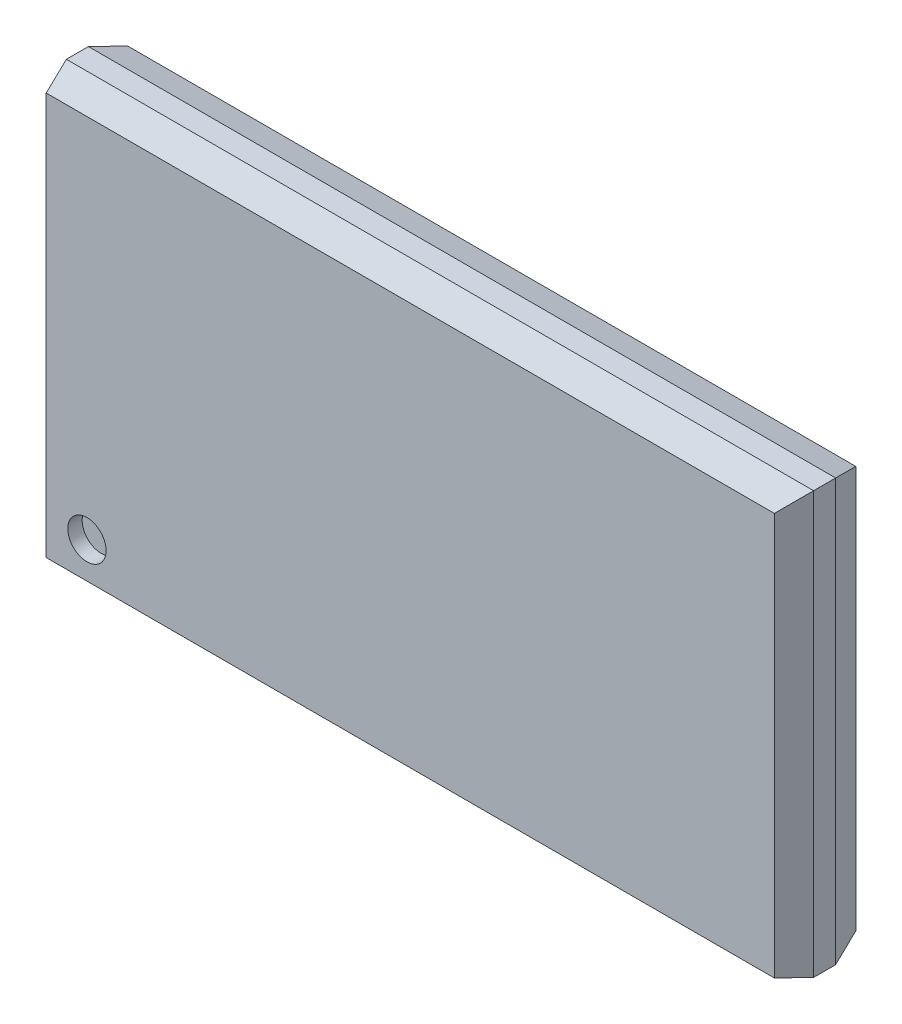
ISO-10303-21;
HEADER;
FILE_DESCRIPTION(('STEP AP214'),'2;1');
FILE_NAME('part.step','',(''),(''),'','','');
FILE_SCHEMA(('AUTOMOTIVE_DESIGN { 1 0 10303 214 1 1 1 1 }'));
ENDSEC;
DATA;
#1=APPLICATION_CONTEXT('core data for automotive mechanical design processes');
#2=APPLICATION_PROTOCOL_DEFINITION('international standard','automotive_design',2000,#1);
#3=PRODUCT_CONTEXT('',#1,'mechanical');
#4=PRODUCT('Part','Part','',(#3));
#5=PRODUCT_RELATED_PRODUCT_CATEGORY('part','',(#4));
#6=PRODUCT_DEFINITION_FORMATION('','',#4);
#7=PRODUCT_DEFINITION_CONTEXT('part definition',#1,'design');
#8=PRODUCT_DEFINITION('design','',#6,#7);
#9=PRODUCT_DEFINITION_SHAPE('','',#8);
#10=(LENGTH_UNIT() NAMED_UNIT(*) SI_UNIT(.MILLI.,.METRE.));
#11=(NAMED_UNIT(*) PLANE_ANGLE_UNIT() SI_UNIT($,.RADIAN.));
#12=(NAMED_UNIT(*) SI_UNIT($,.STERADIAN.) SOLID_ANGLE_UNIT());
#13=UNCERTAINTY_MEASURE_WITH_UNIT(LENGTH_MEASURE(1.E-05),#10,'distance_accuracy_value','');
#14=(GEOMETRIC_REPRESENTATION_CONTEXT(3) GLOBAL_UNCERTAINTY_ASSIGNED_CONTEXT((#13)) GLOBAL_UNIT_ASSIGNED_CONTEXT((#10,
#11,#12)) REPRESENTATION_CONTEXT('',''));
#15=CARTESIAN_POINT('',(0.,0.,0.));
#16=DIRECTION('',(0.,0.,1.));
#17=DIRECTION('',(1.,0.,0.));
#18=AXIS2_PLACEMENT_3D('',#15,#16,#17);
#19=CARTESIAN_POINT('',(-3.375,-1.725,0.85));
#20=DIRECTION('',(0.,0.,1.));
#21=DIRECTION('',(1.,0.,0.));
#22=AXIS2_PLACEMENT_3D('',#19,#20,#21);
#23=PLANE('',#22);
#24=CARTESIAN_POINT('',(-3.375,-1.725,0.85));
#25=DIRECTION('',(0.,0.,-1.));
#26=DIRECTION('',(-1.,0.,0.));
#27=AXIS2_PLACEMENT_3D('',#24,#25,#26);
#28=CIRCLE('',#27,0.2);
#29=CARTESIAN_POINT('',(-3.575,-1.725,0.85));
#30=VERTEX_POINT('',#29);
#31=EDGE_CURVE('E19',#30,#30,#28,.F.);
#32=ORIENTED_EDGE('',*,*,#31,.T.);
#33=EDGE_LOOP('',(#32));
#34=FACE_BOUND('',#33,.T.);
#35=ADVANCED_FACE('F16',(#34),#23,.T.);
#36=CARTESIAN_POINT('',(-3.375,-1.725,1.85));
#37=DIRECTION('',(0.,0.,-1.));
#38=DIRECTION('',(-1.,0.,0.));
#39=AXIS2_PLACEMENT_3D('',#36,#37,#38);
#40=CYLINDRICAL_SURFACE('',#39,0.2);
#41=ORIENTED_EDGE('',*,*,#31,.F.);
#42=EDGE_LOOP('',(#41));
#43=FACE_BOUND('',#42,.T.);
#44=CARTESIAN_POINT('',(-3.375,-1.725,1.));
#45=DIRECTION('',(0.,0.,-1.));
#46=DIRECTION('',(-1.,0.,0.));
#47=AXIS2_PLACEMENT_3D('',#44,#45,#46);
#48=CIRCLE('',#47,0.2);
#49=CARTESIAN_POINT('',(-3.575,-1.725,1.));
#50=VERTEX_POINT('',#49);
#51=EDGE_CURVE('E100',#50,#50,#48,.T.);
#52=ORIENTED_EDGE('',*,*,#51,.F.);
#53=EDGE_LOOP('',(#52));
#54=FACE_BOUND('',#53,.T.);
#55=ADVANCED_FACE('F115',(#43,#54),#40,.F.);
#56=CARTESIAN_POINT('',(0.,0.,1.));
#57=DIRECTION('',(0.,0.,1.));
#58=DIRECTION('',(1.,0.,0.));
#59=AXIS2_PLACEMENT_3D('',#56,#57,#58);
#60=PLANE('',#59);
#61=ORIENTED_EDGE('',*,*,#51,.T.);
#62=EDGE_LOOP('',(#61));
#63=FACE_BOUND('',#62,.T.);
#64=DIRECTION('',(0.,1.,0.));
#65=VECTOR('',#64,1.);
#66=CARTESIAN_POINT('',(-3.8,0.,1.));
#67=LINE('',#66,#65);
#68=CARTESIAN_POINT('',(-3.8,-2.1,1.));
#69=VERTEX_POINT('',#68);
#70=CARTESIAN_POINT('',(-3.8,2.1,1.));
#71=VERTEX_POINT('',#70);
#72=EDGE_CURVE('E96',#69,#71,#67,.T.);
#73=ORIENTED_EDGE('',*,*,#72,.F.);
#74=DIRECTION('',(1.,0.,0.));
#75=VECTOR('',#74,1.);
#76=CARTESIAN_POINT('',(0.,-2.1,1.));
#77=LINE('',#76,#75);
#78=CARTESIAN_POINT('',(3.8,-2.1,1.));
#79=VERTEX_POINT('',#78);
#80=EDGE_CURVE('E91',#79,#69,#77,.F.);
#81=ORIENTED_EDGE('',*,*,#80,.F.);
#82=DIRECTION('',(0.,1.,0.));
#83=VECTOR('',#82,1.);
#84=CARTESIAN_POINT('',(3.8,0.,1.));
#85=LINE('',#84,#83);
#86=CARTESIAN_POINT('',(3.8,2.1,1.));
#87=VERTEX_POINT('',#86);
#88=EDGE_CURVE('E82',#79,#87,#85,.T.);
#89=ORIENTED_EDGE('',*,*,#88,.T.);
#90=DIRECTION('',(1.,0.,0.));
#91=VECTOR('',#90,1.);
#92=CARTESIAN_POINT('',(0.,2.1,1.));
#93=LINE('',#92,#91);
#94=EDGE_CURVE('E77',#87,#71,#93,.F.);
#95=ORIENTED_EDGE('',*,*,#94,.T.);
#96=EDGE_LOOP('',(#73,#81,#89,#95));
#97=FACE_BOUND('',#96,.T.);
#98=ADVANCED_FACE('F94',(#63,#97),#60,.T.);
#99=CARTESIAN_POINT('',(0.,-2.1,1.));
#100=DIRECTION('',(0.,-0.951708617760551,0.307002779922758));
#101=DIRECTION('',(0.,-0.307002779922758,-0.951708617760551));
#102=AXIS2_PLACEMENT_3D('',#99,#100,#101);
#103=PLANE('',#102);
#104=DIRECTION('',(0.293483635441874,0.293483635441875,0.909799269869811));
#105=VECTOR('',#104,1.);
#106=CARTESIAN_POINT('',(-3.9,-2.2,0.69));
#107=LINE('',#106,#105);
#108=CARTESIAN_POINT('',(-3.9,-2.2,0.69));
#109=VERTEX_POINT('',#108);
#110=EDGE_CURVE('E337',#109,#69,#107,.T.);
#111=ORIENTED_EDGE('',*,*,#110,.F.);
#112=DIRECTION('',(-1.,0.,0.));
#113=VECTOR('',#112,1.);
#114=CARTESIAN_POINT('',(0.,-2.2,0.69));
#115=LINE('',#114,#113);
#116=CARTESIAN_POINT('',(3.9,-2.2,0.69));
#117=VERTEX_POINT('',#116);
#118=EDGE_CURVE('E103',#109,#117,#115,.F.);
#119=ORIENTED_EDGE('',*,*,#118,.T.);
#120=DIRECTION('',(-0.293483635441874,0.293483635441875,0.909799269869811));
#121=VECTOR('',#120,1.);
#122=CARTESIAN_POINT('',(3.9,-2.2,0.69));
#123=LINE('',#122,#121);
#124=EDGE_CURVE('E87',#117,#79,#123,.T.);
#125=ORIENTED_EDGE('',*,*,#124,.T.);
#126=ORIENTED_EDGE('',*,*,#80,.T.);
#127=EDGE_LOOP('',(#111,#119,#125,#126));
#128=FACE_BOUND('',#127,.T.);
#129=ADVANCED_FACE('F102',(#128),#103,.T.);
#130=CARTESIAN_POINT('',(3.9,0.,0.69));
#131=DIRECTION('',(-0.951708617760551,0.,-0.307002779922758));
#132=DIRECTION('',(-0.307002779922758,0.,0.951708617760551));
#133=AXIS2_PLACEMENT_3D('',#130,#131,#132);
#134=PLANE('',#133);
#135=DIRECTION('',(0.,1.,0.));
#136=VECTOR('',#135,1.);
#137=CARTESIAN_POINT('',(3.9,0.,0.69));
#138=LINE('',#137,#136);
#139=CARTESIAN_POINT('',(3.9,2.2,0.69));
#140=VERTEX_POINT('',#139);
#141=EDGE_CURVE('E331',#140,#117,#138,.F.);
#142=ORIENTED_EDGE('',*,*,#141,.F.);
#143=DIRECTION('',(-0.293483635441874,-0.293483635441874,0.909799269869812));
#144=VECTOR('',#143,1.);
#145=CARTESIAN_POINT('',(3.9,2.2,0.69));
#146=LINE('',#145,#144);
#147=EDGE_CURVE('E89',#140,#87,#146,.T.);
#148=ORIENTED_EDGE('',*,*,#147,.T.);
#149=ORIENTED_EDGE('',*,*,#88,.F.);
#150=ORIENTED_EDGE('',*,*,#124,.F.);
#151=EDGE_LOOP('',(#142,#148,#149,#150));
#152=FACE_BOUND('',#151,.T.);
#153=ADVANCED_FACE('F85',(#152),#134,.F.);
#154=CARTESIAN_POINT('',(0.,2.2,0.69));
#155=DIRECTION('',(0.,-0.951708617760551,-0.307002779922758));
#156=DIRECTION('',(0.,0.307002779922758,-0.951708617760551));
#157=AXIS2_PLACEMENT_3D('',#154,#155,#156);
#158=PLANE('',#157);
#159=DIRECTION('',(-1.,0.,0.));
#160=VECTOR('',#159,1.);
#161=CARTESIAN_POINT('',(0.,2.2,0.69));
#162=LINE('',#161,#160);
#163=CARTESIAN_POINT('',(-3.9,2.2,0.69));
#164=VERTEX_POINT('',#163);
#165=EDGE_CURVE('E305',#164,#140,#162,.F.);
#166=ORIENTED_EDGE('',*,*,#165,.F.);
#167=DIRECTION('',(-0.293483635441874,0.293483635441875,-0.909799269869811));
#168=VECTOR('',#167,1.);
#169=CARTESIAN_POINT('',(-3.8,2.1,1.));
#170=LINE('',#169,#168);
#171=EDGE_CURVE('E307',#71,#164,#170,.T.);
#172=ORIENTED_EDGE('',*,*,#171,.F.);
#173=ORIENTED_EDGE('',*,*,#94,.F.);
#174=ORIENTED_EDGE('',*,*,#147,.F.);
#175=EDGE_LOOP('',(#166,#172,#173,#174));
#176=FACE_BOUND('',#175,.T.);
#177=ADVANCED_FACE('F166',(#176),#158,.F.);
#178=CARTESIAN_POINT('',(-3.8,0.,1.));
#179=DIRECTION('',(-0.951708617760551,0.,0.307002779922758));
#180=DIRECTION('',(0.307002779922758,0.,0.951708617760551));
#181=AXIS2_PLACEMENT_3D('',#178,#179,#180);
#182=PLANE('',#181);
#183=ORIENTED_EDGE('',*,*,#110,.T.);
#184=ORIENTED_EDGE('',*,*,#72,.T.);
#185=ORIENTED_EDGE('',*,*,#171,.T.);
#186=DIRECTION('',(0.,1.,0.));
#187=VECTOR('',#186,1.);
#188=CARTESIAN_POINT('',(-3.9,0.,0.69));
#189=LINE('',#188,#187);
#190=EDGE_CURVE('E309',#164,#109,#189,.F.);
#191=ORIENTED_EDGE('',*,*,#190,.T.);
#192=EDGE_LOOP('',(#183,#184,#185,#191));
#193=FACE_BOUND('',#192,.T.);
#194=ADVANCED_FACE('F162',(#193),#182,.T.);
#195=CARTESIAN_POINT('',(0.,-2.2,1.));
#196=DIRECTION('',(0.,1.,0.));
#197=DIRECTION('',(-1.,0.,0.));
#198=AXIS2_PLACEMENT_3D('',#195,#196,#197);
#199=PLANE('',#198);
#200=DIRECTION('',(1.,0.,0.));
#201=VECTOR('',#200,1.);
#202=CARTESIAN_POINT('',(0.,-2.2,0.46));
#203=LINE('',#202,#201);
#204=CARTESIAN_POINT('',(-3.9,-2.2,0.46));
#205=VERTEX_POINT('',#204);
#206=CARTESIAN_POINT('',(3.9,-2.2,0.46));
#207=VERTEX_POINT('',#206);
#208=EDGE_CURVE('E318',#205,#207,#203,.T.);
#209=ORIENTED_EDGE('',*,*,#208,.T.);
#210=DIRECTION('',(0.,0.,-1.));
#211=VECTOR('',#210,1.);
#212=CARTESIAN_POINT('',(3.9,-2.2,1.));
#213=LINE('',#212,#211);
#214=EDGE_CURVE('E333',#117,#207,#213,.T.);
#215=ORIENTED_EDGE('',*,*,#214,.F.);
#216=ORIENTED_EDGE('',*,*,#118,.F.);
#217=DIRECTION('',(0.,0.,-1.));
#218=VECTOR('',#217,1.);
#219=CARTESIAN_POINT('',(-3.9,-2.2,1.));
#220=LINE('',#219,#218);
#221=EDGE_CURVE('E319',#109,#205,#220,.T.);
#222=ORIENTED_EDGE('',*,*,#221,.T.);
#223=EDGE_LOOP('',(#209,#215,#216,#222));
#224=FACE_BOUND('',#223,.T.);
#225=ADVANCED_FACE('F158',(#224),#199,.F.);
#226=CARTESIAN_POINT('',(3.9,0.,1.));
#227=DIRECTION('',(1.,0.,0.));
#228=DIRECTION('',(0.,0.,-1.));
#229=AXIS2_PLACEMENT_3D('',#226,#227,#228);
#230=PLANE('',#229);
#231=DIRECTION('',(0.,0.,1.));
#232=VECTOR('',#231,1.);
#233=CARTESIAN_POINT('',(3.9,2.2,1.));
#234=LINE('',#233,#232);
#235=CARTESIAN_POINT('',(3.9,2.2,0.46));
#236=VERTEX_POINT('',#235);
#237=EDGE_CURVE('E310',#140,#236,#234,.F.);
#238=ORIENTED_EDGE('',*,*,#237,.F.);
#239=ORIENTED_EDGE('',*,*,#141,.T.);
#240=ORIENTED_EDGE('',*,*,#214,.T.);
#241=DIRECTION('',(0.,1.,0.));
#242=VECTOR('',#241,1.);
#243=CARTESIAN_POINT('',(3.9,0.,0.46));
#244=LINE('',#243,#242);
#245=EDGE_CURVE('E358',#236,#207,#244,.F.);
#246=ORIENTED_EDGE('',*,*,#245,.F.);
#247=EDGE_LOOP('',(#238,#239,#240,#246));
#248=FACE_BOUND('',#247,.T.);
#249=ADVANCED_FACE('F154',(#248),#230,.T.);
#250=CARTESIAN_POINT('',(0.,2.2,1.));
#251=DIRECTION('',(0.,1.,0.));
#252=DIRECTION('',(-1.,0.,0.));
#253=AXIS2_PLACEMENT_3D('',#250,#251,#252);
#254=PLANE('',#253);
#255=DIRECTION('',(0.,0.,-1.));
#256=VECTOR('',#255,1.);
#257=CARTESIAN_POINT('',(-3.9,2.2,1.));
#258=LINE('',#257,#256);
#259=CARTESIAN_POINT('',(-3.9,2.2,0.46));
#260=VERTEX_POINT('',#259);
#261=EDGE_CURVE('E313',#260,#164,#258,.F.);
#262=ORIENTED_EDGE('',*,*,#261,.T.);
#263=ORIENTED_EDGE('',*,*,#165,.T.);
#264=ORIENTED_EDGE('',*,*,#237,.T.);
#265=DIRECTION('',(1.,0.,0.));
#266=VECTOR('',#265,1.);
#267=CARTESIAN_POINT('',(0.,2.2,0.46));
#268=LINE('',#267,#266);
#269=EDGE_CURVE('E315',#260,#236,#268,.T.);
#270=ORIENTED_EDGE('',*,*,#269,.F.);
#271=EDGE_LOOP('',(#262,#263,#264,#270));
#272=FACE_BOUND('',#271,.T.);
#273=ADVANCED_FACE('F150',(#272),#254,.T.);
#274=CARTESIAN_POINT('',(-3.9,0.,1.));
#275=DIRECTION('',(1.,0.,0.));
#276=DIRECTION('',(0.,0.,-1.));
#277=AXIS2_PLACEMENT_3D('',#274,#275,#276);
#278=PLANE('',#277);
#279=DIRECTION('',(0.,1.,0.));
#280=VECTOR('',#279,1.);
#281=CARTESIAN_POINT('',(-3.9,0.,0.46));
#282=LINE('',#281,#280);
#283=EDGE_CURVE('E340',#260,#205,#282,.F.);
#284=ORIENTED_EDGE('',*,*,#283,.T.);
#285=ORIENTED_EDGE('',*,*,#221,.F.);
#286=ORIENTED_EDGE('',*,*,#190,.F.);
#287=ORIENTED_EDGE('',*,*,#261,.F.);
#288=EDGE_LOOP('',(#284,#285,#286,#287));
#289=FACE_BOUND('',#288,.T.);
#290=ADVANCED_FACE('F146',(#289),#278,.F.);
#291=CARTESIAN_POINT('',(0.,-2.2,0.46));
#292=DIRECTION('',(0.,0.951708617760551,0.307002779922758));
#293=DIRECTION('',(0.,-0.307002779922758,0.951708617760551));
#294=AXIS2_PLACEMENT_3D('',#291,#292,#293);
#295=PLANE('',#294);
#296=ORIENTED_EDGE('',*,*,#208,.F.);
#297=DIRECTION('',(0.293483635441874,0.293483635441875,-0.909799269869811));
#298=VECTOR('',#297,1.);
#299=CARTESIAN_POINT('',(-3.9,-2.2,0.46));
#300=LINE('',#299,#298);
#301=CARTESIAN_POINT('',(-3.8,-2.1,0.15));
#302=VERTEX_POINT('',#301);
#303=EDGE_CURVE('E345',#205,#302,#300,.T.);
#304=ORIENTED_EDGE('',*,*,#303,.T.);
#305=DIRECTION('',(1.,0.,0.));
#306=VECTOR('',#305,1.);
#307=CARTESIAN_POINT('',(0.,-2.1,0.15));
#308=LINE('',#307,#306);
#309=CARTESIAN_POINT('',(3.8,-2.1,0.15));
#310=VERTEX_POINT('',#309);
#311=EDGE_CURVE('E347',#302,#310,#308,.T.);
#312=ORIENTED_EDGE('',*,*,#311,.T.);
#313=DIRECTION('',(-0.293483635441874,0.293483635441875,-0.909799269869811));
#314=VECTOR('',#313,1.);
#315=CARTESIAN_POINT('',(3.9,-2.2,0.46));
#316=LINE('',#315,#314);
#317=EDGE_CURVE('E322',#207,#310,#316,.T.);
#318=ORIENTED_EDGE('',*,*,#317,.F.);
#319=EDGE_LOOP('',(#296,#304,#312,#318));
#320=FACE_BOUND('',#319,.T.);
#321=ADVANCED_FACE('F142',(#320),#295,.F.);
#322=CARTESIAN_POINT('',(3.8,0.,0.15));
#323=DIRECTION('',(0.951708617760551,0.,-0.307002779922758));
#324=DIRECTION('',(-0.307002779922758,0.,-0.951708617760551));
#325=AXIS2_PLACEMENT_3D('',#322,#323,#324);
#326=PLANE('',#325);
#327=DIRECTION('',(-0.293483635441874,-0.293483635441874,-0.909799269869812));
#328=VECTOR('',#327,1.);
#329=CARTESIAN_POINT('',(3.9,2.2,0.46));
#330=LINE('',#329,#328);
#331=CARTESIAN_POINT('',(3.8,2.1,0.15));
#332=VERTEX_POINT('',#331);
#333=EDGE_CURVE('E355',#236,#332,#330,.T.);
#334=ORIENTED_EDGE('',*,*,#333,.F.);
#335=ORIENTED_EDGE('',*,*,#245,.T.);
#336=ORIENTED_EDGE('',*,*,#317,.T.);
#337=DIRECTION('',(0.,1.,0.));
#338=VECTOR('',#337,1.);
#339=CARTESIAN_POINT('',(3.8,0.,0.15));
#340=LINE('',#339,#338);
#341=EDGE_CURVE('E349',#310,#332,#340,.T.);
#342=ORIENTED_EDGE('',*,*,#341,.T.);
#343=EDGE_LOOP('',(#334,#335,#336,#342));
#344=FACE_BOUND('',#343,.T.);
#345=ADVANCED_FACE('F138',(#344),#326,.T.);
#346=CARTESIAN_POINT('',(0.,2.1,0.15));
#347=DIRECTION('',(0.,0.951708617760551,-0.307002779922758));
#348=DIRECTION('',(0.,0.307002779922758,0.951708617760551));
#349=AXIS2_PLACEMENT_3D('',#346,#347,#348);
#350=PLANE('',#349);
#351=ORIENTED_EDGE('',*,*,#333,.T.);
#352=DIRECTION('',(1.,0.,0.));
#353=VECTOR('',#352,1.);
#354=CARTESIAN_POINT('',(0.,2.1,0.15));
#355=LINE('',#354,#353);
#356=CARTESIAN_POINT('',(-3.8,2.1,0.15));
#357=VERTEX_POINT('',#356);
#358=EDGE_CURVE('E25',#332,#357,#355,.F.);
#359=ORIENTED_EDGE('',*,*,#358,.T.);
#360=DIRECTION('',(-0.293483635441874,0.293483635441875,0.909799269869811));
#361=VECTOR('',#360,1.);
#362=CARTESIAN_POINT('',(-3.8,2.1,0.15));
#363=LINE('',#362,#361);
#364=EDGE_CURVE('E33',#357,#260,#363,.T.);
#365=ORIENTED_EDGE('',*,*,#364,.T.);
#366=ORIENTED_EDGE('',*,*,#269,.T.);
#367=EDGE_LOOP('',(#351,#359,#365,#366));
#368=FACE_BOUND('',#367,.T.);
#369=ADVANCED_FACE('F132',(#368),#350,.T.);
#370=CARTESIAN_POINT('',(-3.9,0.,0.46));
#371=DIRECTION('',(0.951708617760551,0.,0.307002779922758));
#372=DIRECTION('',(0.307002779922758,0.,-0.951708617760551));
#373=AXIS2_PLACEMENT_3D('',#370,#371,#372);
#374=PLANE('',#373);
#375=ORIENTED_EDGE('',*,*,#283,.F.);
#376=ORIENTED_EDGE('',*,*,#364,.F.);
#377=DIRECTION('',(0.,1.,0.));
#378=VECTOR('',#377,1.);
#379=CARTESIAN_POINT('',(-3.8,0.,0.15));
#380=LINE('',#379,#378);
#381=EDGE_CURVE('E10',#357,#302,#380,.F.);
#382=ORIENTED_EDGE('',*,*,#381,.T.);
#383=ORIENTED_EDGE('',*,*,#303,.F.);
#384=EDGE_LOOP('',(#375,#376,#382,#383));
#385=FACE_BOUND('',#384,.T.);
#386=ADVANCED_FACE('F126',(#385),#374,.F.);
#387=CARTESIAN_POINT('',(0.,0.,0.15));
#388=DIRECTION('',(0.,0.,1.));
#389=DIRECTION('',(1.,0.,0.));
#390=AXIS2_PLACEMENT_3D('',#387,#388,#389);
#391=PLANE('',#390);
#392=ORIENTED_EDGE('',*,*,#358,.F.);
#393=ORIENTED_EDGE('',*,*,#341,.F.);
#394=ORIENTED_EDGE('',*,*,#311,.F.);
#395=ORIENTED_EDGE('',*,*,#381,.F.);
#396=EDGE_LOOP('',(#392,#393,#394,#395));
#397=FACE_BOUND('',#396,.T.);
#398=ADVANCED_FACE('F124',(#397),#391,.F.);
#399=CLOSED_SHELL('',(#35,#55,#98,#129,#153,#177,#194,#225,#249,#273,#290,#321,#345,#369,#386,#398));
#400=MANIFOLD_SOLID_BREP('B1',#399);
#401=ADVANCED_BREP_SHAPE_REPRESENTATION('',(#18,#400),#14);
#402=SHAPE_DEFINITION_REPRESENTATION(#9,#401);
ENDSEC;
END-ISO-10303-21;
